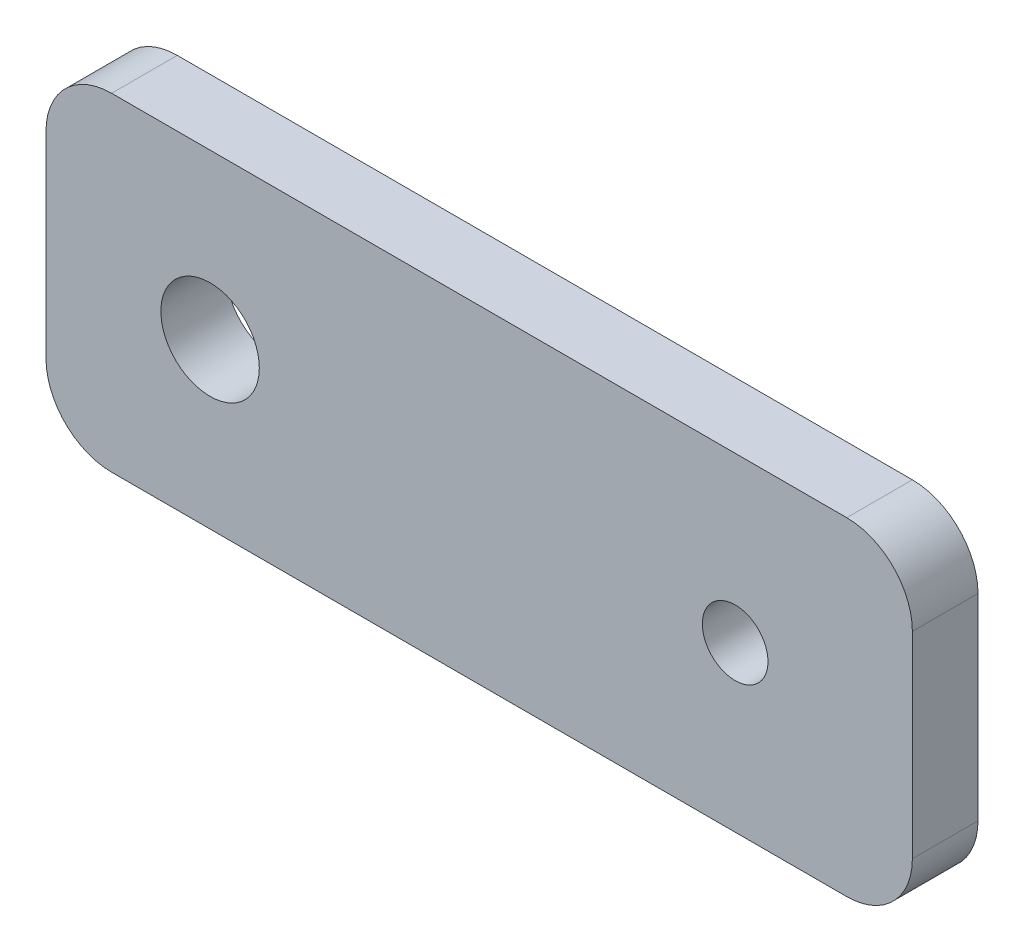
ISO-10303-21;
HEADER;
FILE_DESCRIPTION(('STEP AP214'),'2;1');
FILE_NAME('part.step','',(''),(''),'','','');
FILE_SCHEMA(('AUTOMOTIVE_DESIGN { 1 0 10303 214 1 1 1 1 }'));
ENDSEC;
DATA;
#1=APPLICATION_CONTEXT('core data for automotive mechanical design processes');
#2=APPLICATION_PROTOCOL_DEFINITION('international standard','automotive_design',2000,#1);
#3=PRODUCT_CONTEXT('',#1,'mechanical');
#4=PRODUCT('Part','Part','',(#3));
#5=PRODUCT_RELATED_PRODUCT_CATEGORY('part','',(#4));
#6=PRODUCT_DEFINITION_FORMATION('','',#4);
#7=PRODUCT_DEFINITION_CONTEXT('part definition',#1,'design');
#8=PRODUCT_DEFINITION('design','',#6,#7);
#9=PRODUCT_DEFINITION_SHAPE('','',#8);
#10=(LENGTH_UNIT() NAMED_UNIT(*) SI_UNIT(.MILLI.,.METRE.));
#11=(NAMED_UNIT(*) PLANE_ANGLE_UNIT() SI_UNIT($,.RADIAN.));
#12=(NAMED_UNIT(*) SI_UNIT($,.STERADIAN.) SOLID_ANGLE_UNIT());
#13=UNCERTAINTY_MEASURE_WITH_UNIT(LENGTH_MEASURE(1.E-05),#10,'distance_accuracy_value','');
#14=(GEOMETRIC_REPRESENTATION_CONTEXT(3) GLOBAL_UNCERTAINTY_ASSIGNED_CONTEXT((#13)) GLOBAL_UNIT_ASSIGNED_CONTEXT((#10,
#11,#12)) REPRESENTATION_CONTEXT('',''));
#15=CARTESIAN_POINT('',(0.,0.,0.));
#16=DIRECTION('',(0.,0.,1.));
#17=DIRECTION('',(1.,0.,0.));
#18=AXIS2_PLACEMENT_3D('',#15,#16,#17);
#19=CARTESIAN_POINT('',(0.,0.,2.54));
#20=DIRECTION('',(-1.,0.,0.));
#21=DIRECTION('',(0.,-1.,0.));
#22=AXIS2_PLACEMENT_3D('',#19,#20,#21);
#23=PLANE('',#22);
#24=DIRECTION('',(0.,1.,0.));
#25=VECTOR('',#24,1.);
#26=CARTESIAN_POINT('',(0.,0.,2.54));
#27=LINE('',#26,#25);
#28=CARTESIAN_POINT('',(0.,2.54,2.54));
#29=VERTEX_POINT('',#28);
#30=CARTESIAN_POINT('',(0.,10.16,2.54));
#31=VERTEX_POINT('',#30);
#32=EDGE_CURVE('E129',#29,#31,#27,.T.);
#33=ORIENTED_EDGE('',*,*,#32,.F.);
#34=DIRECTION('',(0.,0.,-1.));
#35=VECTOR('',#34,1.);
#36=CARTESIAN_POINT('',(0.,2.54,2.54));
#37=LINE('',#36,#35);
#38=CARTESIAN_POINT('',(0.,2.54,0.));
#39=VERTEX_POINT('',#38);
#40=EDGE_CURVE('E155',#29,#39,#37,.T.);
#41=ORIENTED_EDGE('',*,*,#40,.T.);
#42=DIRECTION('',(0.,1.,0.));
#43=VECTOR('',#42,1.);
#44=CARTESIAN_POINT('',(0.,0.,0.));
#45=LINE('',#44,#43);
#46=CARTESIAN_POINT('',(0.,10.16,0.));
#47=VERTEX_POINT('',#46);
#48=EDGE_CURVE('E161',#39,#47,#45,.T.);
#49=ORIENTED_EDGE('',*,*,#48,.T.);
#50=DIRECTION('',(0.,0.,-1.));
#51=VECTOR('',#50,1.);
#52=CARTESIAN_POINT('',(0.,10.16,2.54));
#53=LINE('',#52,#51);
#54=EDGE_CURVE('E153',#47,#31,#53,.F.);
#55=ORIENTED_EDGE('',*,*,#54,.T.);
#56=EDGE_LOOP('',(#33,#41,#49,#55));
#57=FACE_BOUND('',#56,.T.);
#58=ADVANCED_FACE('F37',(#57),#23,.F.);
#59=CARTESIAN_POINT('',(0.,12.7,2.54));
#60=DIRECTION('',(0.,-1.,0.));
#61=DIRECTION('',(1.,0.,0.));
#62=AXIS2_PLACEMENT_3D('',#59,#60,#61);
#63=PLANE('',#62);
#64=DIRECTION('',(-1.,0.,0.));
#65=VECTOR('',#64,1.);
#66=CARTESIAN_POINT('',(0.,12.7,2.54));
#67=LINE('',#66,#65);
#68=CARTESIAN_POINT('',(-2.54,12.7,2.54));
#69=VERTEX_POINT('',#68);
#70=CARTESIAN_POINT('',(-30.988,12.7,2.54));
#71=VERTEX_POINT('',#70);
#72=EDGE_CURVE('E132',#69,#71,#67,.T.);
#73=ORIENTED_EDGE('',*,*,#72,.F.);
#74=DIRECTION('',(0.,0.,-1.));
#75=VECTOR('',#74,1.);
#76=CARTESIAN_POINT('',(-2.54,12.7,2.54));
#77=LINE('',#76,#75);
#78=CARTESIAN_POINT('',(-2.54,12.7,0.));
#79=VERTEX_POINT('',#78);
#80=EDGE_CURVE('E11',#69,#79,#77,.T.);
#81=ORIENTED_EDGE('',*,*,#80,.T.);
#82=DIRECTION('',(-1.,0.,0.));
#83=VECTOR('',#82,1.);
#84=CARTESIAN_POINT('',(0.,12.7,0.));
#85=LINE('',#84,#83);
#86=CARTESIAN_POINT('',(-30.988,12.7,0.));
#87=VERTEX_POINT('',#86);
#88=EDGE_CURVE('E134',#79,#87,#85,.T.);
#89=ORIENTED_EDGE('',*,*,#88,.T.);
#90=DIRECTION('',(0.,0.,-1.));
#91=VECTOR('',#90,1.);
#92=CARTESIAN_POINT('',(-30.988,12.7,2.54));
#93=LINE('',#92,#91);
#94=EDGE_CURVE('E45',#87,#71,#93,.F.);
#95=ORIENTED_EDGE('',*,*,#94,.T.);
#96=EDGE_LOOP('',(#73,#81,#89,#95));
#97=FACE_BOUND('',#96,.T.);
#98=ADVANCED_FACE('F199',(#97),#63,.F.);
#99=CARTESIAN_POINT('',(-33.528,0.,2.54));
#100=DIRECTION('',(1.,0.,0.));
#101=DIRECTION('',(0.,0.,-1.));
#102=AXIS2_PLACEMENT_3D('',#99,#100,#101);
#103=PLANE('',#102);
#104=DIRECTION('',(0.,-1.,0.));
#105=VECTOR('',#104,1.);
#106=CARTESIAN_POINT('',(-33.528,0.,0.));
#107=LINE('',#106,#105);
#108=CARTESIAN_POINT('',(-33.528,10.16,0.));
#109=VERTEX_POINT('',#108);
#110=CARTESIAN_POINT('',(-33.528,2.54,0.));
#111=VERTEX_POINT('',#110);
#112=EDGE_CURVE('E130',#109,#111,#107,.T.);
#113=ORIENTED_EDGE('',*,*,#112,.T.);
#114=DIRECTION('',(0.,0.,-1.));
#115=VECTOR('',#114,1.);
#116=CARTESIAN_POINT('',(-33.528,2.54,2.54));
#117=LINE('',#116,#115);
#118=CARTESIAN_POINT('',(-33.528,2.54,2.54));
#119=VERTEX_POINT('',#118);
#120=EDGE_CURVE('E108',#111,#119,#117,.F.);
#121=ORIENTED_EDGE('',*,*,#120,.T.);
#122=DIRECTION('',(0.,-1.,0.));
#123=VECTOR('',#122,1.);
#124=CARTESIAN_POINT('',(-33.528,0.,2.54));
#125=LINE('',#124,#123);
#126=CARTESIAN_POINT('',(-33.528,10.16,2.54));
#127=VERTEX_POINT('',#126);
#128=EDGE_CURVE('E173',#127,#119,#125,.T.);
#129=ORIENTED_EDGE('',*,*,#128,.F.);
#130=DIRECTION('',(0.,0.,-1.));
#131=VECTOR('',#130,1.);
#132=CARTESIAN_POINT('',(-33.528,10.16,2.54));
#133=LINE('',#132,#131);
#134=EDGE_CURVE('E113',#127,#109,#133,.T.);
#135=ORIENTED_EDGE('',*,*,#134,.T.);
#136=EDGE_LOOP('',(#113,#121,#129,#135));
#137=FACE_BOUND('',#136,.T.);
#138=ADVANCED_FACE('F197',(#137),#103,.F.);
#139=CARTESIAN_POINT('',(0.,0.,2.54));
#140=DIRECTION('',(0.,1.,0.));
#141=DIRECTION('',(-1.,0.,0.));
#142=AXIS2_PLACEMENT_3D('',#139,#140,#141);
#143=PLANE('',#142);
#144=DIRECTION('',(1.,0.,0.));
#145=VECTOR('',#144,1.);
#146=CARTESIAN_POINT('',(0.,0.,2.54));
#147=LINE('',#146,#145);
#148=CARTESIAN_POINT('',(-30.988,0.,2.54));
#149=VERTEX_POINT('',#148);
#150=CARTESIAN_POINT('',(-2.54,0.,2.54));
#151=VERTEX_POINT('',#150);
#152=EDGE_CURVE('E123',#149,#151,#147,.T.);
#153=ORIENTED_EDGE('',*,*,#152,.F.);
#154=DIRECTION('',(0.,0.,-1.));
#155=VECTOR('',#154,1.);
#156=CARTESIAN_POINT('',(-30.988,0.,2.54));
#157=LINE('',#156,#155);
#158=CARTESIAN_POINT('',(-30.988,0.,0.));
#159=VERTEX_POINT('',#158);
#160=EDGE_CURVE('E107',#149,#159,#157,.T.);
#161=ORIENTED_EDGE('',*,*,#160,.T.);
#162=DIRECTION('',(1.,0.,0.));
#163=VECTOR('',#162,1.);
#164=CARTESIAN_POINT('',(0.,0.,0.));
#165=LINE('',#164,#163);
#166=CARTESIAN_POINT('',(-2.54,0.,0.));
#167=VERTEX_POINT('',#166);
#168=EDGE_CURVE('E120',#159,#167,#165,.T.);
#169=ORIENTED_EDGE('',*,*,#168,.T.);
#170=DIRECTION('',(0.,0.,-1.));
#171=VECTOR('',#170,1.);
#172=CARTESIAN_POINT('',(-2.54,0.,2.54));
#173=LINE('',#172,#171);
#174=EDGE_CURVE('E125',#167,#151,#173,.F.);
#175=ORIENTED_EDGE('',*,*,#174,.T.);
#176=EDGE_LOOP('',(#153,#161,#169,#175));
#177=FACE_BOUND('',#176,.T.);
#178=ADVANCED_FACE('F119',(#177),#143,.F.);
#179=CARTESIAN_POINT('',(0.,0.,2.54));
#180=DIRECTION('',(0.,0.,1.));
#181=DIRECTION('',(1.,0.,0.));
#182=AXIS2_PLACEMENT_3D('',#179,#180,#181);
#183=PLANE('',#182);
#184=CARTESIAN_POINT('',(-27.178,6.35,2.54));
#185=DIRECTION('',(0.,0.,1.));
#186=DIRECTION('',(1.,0.,0.));
#187=AXIS2_PLACEMENT_3D('',#184,#185,#186);
#188=CIRCLE('',#187,1.905);
#189=CARTESIAN_POINT('',(-25.273,6.35,2.54));
#190=VERTEX_POINT('',#189);
#191=EDGE_CURVE('E169',#190,#190,#188,.T.);
#192=ORIENTED_EDGE('',*,*,#191,.F.);
#193=EDGE_LOOP('',(#192));
#194=FACE_BOUND('',#193,.T.);
#195=CARTESIAN_POINT('',(-6.85799999999999,6.35,2.54));
#196=DIRECTION('',(0.,0.,1.));
#197=DIRECTION('',(1.,0.,0.));
#198=AXIS2_PLACEMENT_3D('',#195,#196,#197);
#199=CIRCLE('',#198,1.27);
#200=CARTESIAN_POINT('',(-5.58799999999999,6.35,2.54));
#201=VERTEX_POINT('',#200);
#202=EDGE_CURVE('E177',#201,#201,#199,.T.);
#203=ORIENTED_EDGE('',*,*,#202,.F.);
#204=EDGE_LOOP('',(#203));
#205=FACE_BOUND('',#204,.T.);
#206=ORIENTED_EDGE('',*,*,#128,.T.);
#207=CARTESIAN_POINT('',(-30.988,2.54,2.54));
#208=DIRECTION('',(0.,0.,1.));
#209=DIRECTION('',(1.,0.,0.));
#210=AXIS2_PLACEMENT_3D('',#207,#208,#209);
#211=CIRCLE('',#210,2.54);
#212=EDGE_CURVE('E151',#119,#149,#211,.T.);
#213=ORIENTED_EDGE('',*,*,#212,.T.);
#214=ORIENTED_EDGE('',*,*,#152,.T.);
#215=CARTESIAN_POINT('',(-2.54,2.54,2.54));
#216=DIRECTION('',(0.,0.,1.));
#217=DIRECTION('',(1.,0.,0.));
#218=AXIS2_PLACEMENT_3D('',#215,#216,#217);
#219=CIRCLE('',#218,2.54);
#220=EDGE_CURVE('E149',#151,#29,#219,.T.);
#221=ORIENTED_EDGE('',*,*,#220,.T.);
#222=ORIENTED_EDGE('',*,*,#32,.T.);
#223=CARTESIAN_POINT('',(-2.54,10.16,2.54));
#224=DIRECTION('',(0.,0.,1.));
#225=DIRECTION('',(1.,0.,0.));
#226=AXIS2_PLACEMENT_3D('',#223,#224,#225);
#227=CIRCLE('',#226,2.54);
#228=EDGE_CURVE('E58',#31,#69,#227,.T.);
#229=ORIENTED_EDGE('',*,*,#228,.T.);
#230=ORIENTED_EDGE('',*,*,#72,.T.);
#231=CARTESIAN_POINT('',(-30.988,10.16,2.54));
#232=DIRECTION('',(0.,0.,1.));
#233=DIRECTION('',(1.,0.,0.));
#234=AXIS2_PLACEMENT_3D('',#231,#232,#233);
#235=CIRCLE('',#234,2.54);
#236=EDGE_CURVE('E146',#71,#127,#235,.T.);
#237=ORIENTED_EDGE('',*,*,#236,.T.);
#238=EDGE_LOOP('',(#206,#213,#214,#221,#222,#229,#230,#237));
#239=FACE_BOUND('',#238,.T.);
#240=ADVANCED_FACE('F188',(#194,#205,#239),#183,.T.);
#241=CARTESIAN_POINT('',(0.,0.,0.));
#242=DIRECTION('',(0.,0.,1.));
#243=DIRECTION('',(1.,0.,0.));
#244=AXIS2_PLACEMENT_3D('',#241,#242,#243);
#245=PLANE('',#244);
#246=CARTESIAN_POINT('',(-27.178,6.35,0.));
#247=DIRECTION('',(0.,0.,1.));
#248=DIRECTION('',(1.,0.,0.));
#249=AXIS2_PLACEMENT_3D('',#246,#247,#248);
#250=CIRCLE('',#249,1.905);
#251=CARTESIAN_POINT('',(-25.273,6.35,0.));
#252=VERTEX_POINT('',#251);
#253=EDGE_CURVE('E166',#252,#252,#250,.T.);
#254=ORIENTED_EDGE('',*,*,#253,.T.);
#255=EDGE_LOOP('',(#254));
#256=FACE_BOUND('',#255,.T.);
#257=CARTESIAN_POINT('',(-6.85799999999999,6.35,0.));
#258=DIRECTION('',(0.,0.,1.));
#259=DIRECTION('',(1.,0.,0.));
#260=AXIS2_PLACEMENT_3D('',#257,#258,#259);
#261=CIRCLE('',#260,1.27);
#262=CARTESIAN_POINT('',(-5.58799999999999,6.35,0.));
#263=VERTEX_POINT('',#262);
#264=EDGE_CURVE('E180',#263,#263,#261,.T.);
#265=ORIENTED_EDGE('',*,*,#264,.T.);
#266=EDGE_LOOP('',(#265));
#267=FACE_BOUND('',#266,.T.);
#268=ORIENTED_EDGE('',*,*,#168,.F.);
#269=CARTESIAN_POINT('',(-30.988,2.54,0.));
#270=DIRECTION('',(0.,0.,1.));
#271=DIRECTION('',(1.,0.,0.));
#272=AXIS2_PLACEMENT_3D('',#269,#270,#271);
#273=CIRCLE('',#272,2.54);
#274=EDGE_CURVE('E103',#159,#111,#273,.F.);
#275=ORIENTED_EDGE('',*,*,#274,.T.);
#276=ORIENTED_EDGE('',*,*,#112,.F.);
#277=CARTESIAN_POINT('',(-30.988,10.16,0.));
#278=DIRECTION('',(0.,0.,1.));
#279=DIRECTION('',(1.,0.,0.));
#280=AXIS2_PLACEMENT_3D('',#277,#278,#279);
#281=CIRCLE('',#280,2.54);
#282=EDGE_CURVE('E124',#109,#87,#281,.F.);
#283=ORIENTED_EDGE('',*,*,#282,.T.);
#284=ORIENTED_EDGE('',*,*,#88,.F.);
#285=CARTESIAN_POINT('',(-2.54,10.16,0.));
#286=DIRECTION('',(0.,0.,1.));
#287=DIRECTION('',(1.,0.,0.));
#288=AXIS2_PLACEMENT_3D('',#285,#286,#287);
#289=CIRCLE('',#288,2.54);
#290=EDGE_CURVE('E140',#79,#47,#289,.F.);
#291=ORIENTED_EDGE('',*,*,#290,.T.);
#292=ORIENTED_EDGE('',*,*,#48,.F.);
#293=CARTESIAN_POINT('',(-2.54,2.54,0.));
#294=DIRECTION('',(0.,0.,1.));
#295=DIRECTION('',(1.,0.,0.));
#296=AXIS2_PLACEMENT_3D('',#293,#294,#295);
#297=CIRCLE('',#296,2.54);
#298=EDGE_CURVE('E114',#39,#167,#297,.F.);
#299=ORIENTED_EDGE('',*,*,#298,.T.);
#300=EDGE_LOOP('',(#268,#275,#276,#283,#284,#291,#292,#299));
#301=FACE_BOUND('',#300,.T.);
#302=ADVANCED_FACE('F127',(#256,#267,#301),#245,.F.);
#303=CARTESIAN_POINT('',(-30.988,2.54,2.54));
#304=DIRECTION('',(0.,0.,-1.));
#305=DIRECTION('',(-1.,0.,0.));
#306=AXIS2_PLACEMENT_3D('',#303,#304,#305);
#307=CYLINDRICAL_SURFACE('',#306,2.54);
#308=ORIENTED_EDGE('',*,*,#212,.F.);
#309=ORIENTED_EDGE('',*,*,#120,.F.);
#310=ORIENTED_EDGE('',*,*,#274,.F.);
#311=ORIENTED_EDGE('',*,*,#160,.F.);
#312=EDGE_LOOP('',(#308,#309,#310,#311));
#313=FACE_BOUND('',#312,.T.);
#314=ADVANCED_FACE('F106',(#313),#307,.T.);
#315=CARTESIAN_POINT('',(-2.54,2.54,2.54));
#316=DIRECTION('',(0.,0.,-1.));
#317=DIRECTION('',(-1.,0.,0.));
#318=AXIS2_PLACEMENT_3D('',#315,#316,#317);
#319=CYLINDRICAL_SURFACE('',#318,2.54);
#320=ORIENTED_EDGE('',*,*,#220,.F.);
#321=ORIENTED_EDGE('',*,*,#174,.F.);
#322=ORIENTED_EDGE('',*,*,#298,.F.);
#323=ORIENTED_EDGE('',*,*,#40,.F.);
#324=EDGE_LOOP('',(#320,#321,#322,#323));
#325=FACE_BOUND('',#324,.T.);
#326=ADVANCED_FACE('F203',(#325),#319,.T.);
#327=CARTESIAN_POINT('',(-2.54,10.16,2.54));
#328=DIRECTION('',(0.,0.,-1.));
#329=DIRECTION('',(-1.,0.,0.));
#330=AXIS2_PLACEMENT_3D('',#327,#328,#329);
#331=CYLINDRICAL_SURFACE('',#330,2.54);
#332=ORIENTED_EDGE('',*,*,#228,.F.);
#333=ORIENTED_EDGE('',*,*,#54,.F.);
#334=ORIENTED_EDGE('',*,*,#290,.F.);
#335=ORIENTED_EDGE('',*,*,#80,.F.);
#336=EDGE_LOOP('',(#332,#333,#334,#335));
#337=FACE_BOUND('',#336,.T.);
#338=ADVANCED_FACE('F202',(#337),#331,.T.);
#339=CARTESIAN_POINT('',(-30.988,10.16,2.54));
#340=DIRECTION('',(0.,0.,-1.));
#341=DIRECTION('',(-1.,0.,0.));
#342=AXIS2_PLACEMENT_3D('',#339,#340,#341);
#343=CYLINDRICAL_SURFACE('',#342,2.54);
#344=ORIENTED_EDGE('',*,*,#236,.F.);
#345=ORIENTED_EDGE('',*,*,#94,.F.);
#346=ORIENTED_EDGE('',*,*,#282,.F.);
#347=ORIENTED_EDGE('',*,*,#134,.F.);
#348=EDGE_LOOP('',(#344,#345,#346,#347));
#349=FACE_BOUND('',#348,.T.);
#350=ADVANCED_FACE('F39',(#349),#343,.T.);
#351=CARTESIAN_POINT('',(-6.85799999999999,6.35,0.));
#352=DIRECTION('',(0.,0.,1.));
#353=DIRECTION('',(1.,0.,0.));
#354=AXIS2_PLACEMENT_3D('',#351,#352,#353);
#355=CYLINDRICAL_SURFACE('',#354,1.27);
#356=ORIENTED_EDGE('',*,*,#264,.F.);
#357=EDGE_LOOP('',(#356));
#358=FACE_BOUND('',#357,.T.);
#359=ORIENTED_EDGE('',*,*,#202,.T.);
#360=EDGE_LOOP('',(#359));
#361=FACE_BOUND('',#360,.T.);
#362=ADVANCED_FACE('F225',(#358,#361),#355,.F.);
#363=CARTESIAN_POINT('',(-27.178,6.35,0.));
#364=DIRECTION('',(0.,0.,1.));
#365=DIRECTION('',(1.,0.,0.));
#366=AXIS2_PLACEMENT_3D('',#363,#364,#365);
#367=CYLINDRICAL_SURFACE('',#366,1.905);
#368=ORIENTED_EDGE('',*,*,#253,.F.);
#369=EDGE_LOOP('',(#368));
#370=FACE_BOUND('',#369,.T.);
#371=ORIENTED_EDGE('',*,*,#191,.T.);
#372=EDGE_LOOP('',(#371));
#373=FACE_BOUND('',#372,.T.);
#374=ADVANCED_FACE('F186',(#370,#373),#367,.F.);
#375=CLOSED_SHELL('',(#58,#98,#138,#178,#240,#302,#314,#326,#338,#350,#362,#374));
#376=MANIFOLD_SOLID_BREP('B2',#375);
#377=ADVANCED_BREP_SHAPE_REPRESENTATION('',(#18,#376),#14);
#378=SHAPE_DEFINITION_REPRESENTATION(#9,#377);
ENDSEC;
END-ISO-10303-21;
